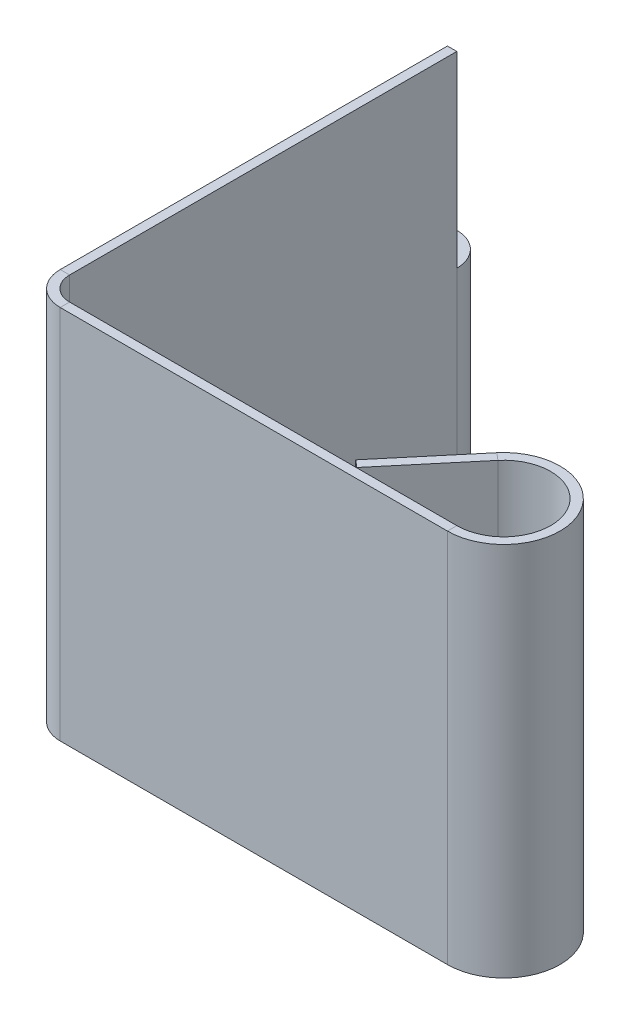
ISO-10303-21;
HEADER;
FILE_DESCRIPTION(('STEP AP214'),'2;1');
FILE_NAME('part.step','',(''),(''),'','','');
FILE_SCHEMA(('AUTOMOTIVE_DESIGN { 1 0 10303 214 1 1 1 1 }'));
ENDSEC;
DATA;
#1=APPLICATION_CONTEXT('core data for automotive mechanical design processes');
#2=APPLICATION_PROTOCOL_DEFINITION('international standard','automotive_design',2000,#1);
#3=PRODUCT_CONTEXT('',#1,'mechanical');
#4=PRODUCT('Part','Part','',(#3));
#5=PRODUCT_RELATED_PRODUCT_CATEGORY('part','',(#4));
#6=PRODUCT_DEFINITION_FORMATION('','',#4);
#7=PRODUCT_DEFINITION_CONTEXT('part definition',#1,'design');
#8=PRODUCT_DEFINITION('design','',#6,#7);
#9=PRODUCT_DEFINITION_SHAPE('','',#8);
#10=(LENGTH_UNIT() NAMED_UNIT(*) SI_UNIT(.MILLI.,.METRE.));
#11=(NAMED_UNIT(*) PLANE_ANGLE_UNIT() SI_UNIT($,.RADIAN.));
#12=(NAMED_UNIT(*) SI_UNIT($,.STERADIAN.) SOLID_ANGLE_UNIT());
#13=UNCERTAINTY_MEASURE_WITH_UNIT(LENGTH_MEASURE(1.E-05),#10,'distance_accuracy_value','');
#14=(GEOMETRIC_REPRESENTATION_CONTEXT(3) GLOBAL_UNCERTAINTY_ASSIGNED_CONTEXT((#13)) GLOBAL_UNIT_ASSIGNED_CONTEXT((#10,
#11,#12)) REPRESENTATION_CONTEXT('',''));
#15=CARTESIAN_POINT('',(0.,0.,0.));
#16=DIRECTION('',(0.,0.,1.));
#17=DIRECTION('',(1.,0.,0.));
#18=AXIS2_PLACEMENT_3D('',#15,#16,#17);
#19=CARTESIAN_POINT('',(10.,160.,0.));
#20=DIRECTION('',(0.,1.,0.));
#21=DIRECTION('',(0.,0.,1.));
#22=AXIS2_PLACEMENT_3D('',#19,#20,#21);
#23=PLANE('',#22);
#24=DIRECTION('',(0.,0.,1.));
#25=VECTOR('',#24,1.);
#26=CARTESIAN_POINT('',(10.,160.,0.));
#27=LINE('',#26,#25);
#28=CARTESIAN_POINT('',(10.,160.,0.));
#29=VERTEX_POINT('',#28);
#30=CARTESIAN_POINT('',(10.,160.,4.));
#31=VERTEX_POINT('',#30);
#32=EDGE_CURVE('E71',#29,#31,#27,.T.);
#33=ORIENTED_EDGE('',*,*,#32,.F.);
#34=CARTESIAN_POINT('',(10.,160.,-10.));
#35=DIRECTION('',(0.,1.,0.));
#36=DIRECTION('',(0.,0.,1.));
#37=AXIS2_PLACEMENT_3D('',#34,#35,#36);
#38=CIRCLE('',#37,10.);
#39=CARTESIAN_POINT('',(0.,160.,-10.0000000000001));
#40=VERTEX_POINT('',#39);
#41=EDGE_CURVE('E292',#40,#29,#38,.T.);
#42=ORIENTED_EDGE('',*,*,#41,.F.);
#43=DIRECTION('',(1.,0.,0.));
#44=VECTOR('',#43,1.);
#45=CARTESIAN_POINT('',(-4.,160.,-10.0000000000001));
#46=LINE('',#45,#44);
#47=CARTESIAN_POINT('',(-4.,160.,-10.0000000000001));
#48=VERTEX_POINT('',#47);
#49=EDGE_CURVE('E352',#48,#40,#46,.T.);
#50=ORIENTED_EDGE('',*,*,#49,.F.);
#51=CARTESIAN_POINT('',(10.,160.,-10.));
#52=DIRECTION('',(0.,1.,0.));
#53=DIRECTION('',(1.,0.,0.));
#54=AXIS2_PLACEMENT_3D('',#51,#52,#53);
#55=CIRCLE('',#54,14.);
#56=EDGE_CURVE('E304',#48,#31,#55,.T.);
#57=ORIENTED_EDGE('',*,*,#56,.T.);
#58=EDGE_LOOP('',(#33,#42,#50,#57));
#59=FACE_BOUND('',#58,.T.);
#60=ADVANCED_FACE('F63',(#59),#23,.T.);
#61=CARTESIAN_POINT('',(-4.,160.,-10.0000000000001));
#62=DIRECTION('',(0.,1.,0.));
#63=DIRECTION('',(0.,0.,1.));
#64=AXIS2_PLACEMENT_3D('',#61,#62,#63);
#65=PLANE('',#64);
#66=DIRECTION('',(1.,0.,0.));
#67=VECTOR('',#66,1.);
#68=CARTESIAN_POINT('',(10.0000000000001,160.,0.));
#69=LINE('',#68,#67);
#70=CARTESIAN_POINT('',(175.,160.,0.));
#71=VERTEX_POINT('',#70);
#72=EDGE_CURVE('E289',#29,#71,#69,.T.);
#73=ORIENTED_EDGE('',*,*,#72,.F.);
#74=ORIENTED_EDGE('',*,*,#32,.T.);
#75=DIRECTION('',(1.,0.,0.));
#76=VECTOR('',#75,1.);
#77=CARTESIAN_POINT('',(10.0000000000001,160.,4.));
#78=LINE('',#77,#76);
#79=CARTESIAN_POINT('',(175.,160.,4.));
#80=VERTEX_POINT('',#79);
#81=EDGE_CURVE('E285',#31,#80,#78,.T.);
#82=ORIENTED_EDGE('',*,*,#81,.T.);
#83=DIRECTION('',(0.,0.,1.));
#84=VECTOR('',#83,1.);
#85=CARTESIAN_POINT('',(175.,160.,0.));
#86=LINE('',#85,#84);
#87=EDGE_CURVE('E218',#71,#80,#86,.T.);
#88=ORIENTED_EDGE('',*,*,#87,.F.);
#89=EDGE_LOOP('',(#73,#74,#82,#88));
#90=FACE_BOUND('',#89,.T.);
#91=ADVANCED_FACE('F355',(#90),#65,.T.);
#92=CARTESIAN_POINT('',(0.,0.,-10.0000000000001));
#93=DIRECTION('',(0.,-1.,0.));
#94=DIRECTION('',(0.,0.,-1.));
#95=AXIS2_PLACEMENT_3D('',#92,#93,#94);
#96=PLANE('',#95);
#97=DIRECTION('',(-1.,0.,0.));
#98=VECTOR('',#97,1.);
#99=CARTESIAN_POINT('',(0.,0.,-10.0000000000001));
#100=LINE('',#99,#98);
#101=CARTESIAN_POINT('',(0.,0.,-10.0000000000001));
#102=VERTEX_POINT('',#101);
#103=CARTESIAN_POINT('',(-4.,0.,-10.0000000000001));
#104=VERTEX_POINT('',#103);
#105=EDGE_CURVE('E350',#102,#104,#100,.T.);
#106=ORIENTED_EDGE('',*,*,#105,.F.);
#107=CARTESIAN_POINT('',(10.,0.,-10.));
#108=DIRECTION('',(0.,1.,0.));
#109=DIRECTION('',(0.,0.,1.));
#110=AXIS2_PLACEMENT_3D('',#107,#108,#109);
#111=CIRCLE('',#110,10.);
#112=CARTESIAN_POINT('',(10.,0.,0.));
#113=VERTEX_POINT('',#112);
#114=EDGE_CURVE('E315',#102,#113,#111,.T.);
#115=ORIENTED_EDGE('',*,*,#114,.T.);
#116=DIRECTION('',(0.,0.,-1.));
#117=VECTOR('',#116,1.);
#118=CARTESIAN_POINT('',(10.,0.,4.));
#119=LINE('',#118,#117);
#120=CARTESIAN_POINT('',(10.,0.,4.));
#121=VERTEX_POINT('',#120);
#122=EDGE_CURVE('E348',#121,#113,#119,.T.);
#123=ORIENTED_EDGE('',*,*,#122,.F.);
#124=CARTESIAN_POINT('',(10.,0.,-10.));
#125=DIRECTION('',(0.,1.,0.));
#126=DIRECTION('',(1.,0.,0.));
#127=AXIS2_PLACEMENT_3D('',#124,#125,#126);
#128=CIRCLE('',#127,14.);
#129=EDGE_CURVE('E287',#104,#121,#128,.T.);
#130=ORIENTED_EDGE('',*,*,#129,.F.);
#131=EDGE_LOOP('',(#106,#115,#123,#130));
#132=FACE_BOUND('',#131,.T.);
#133=ADVANCED_FACE('F405',(#132),#96,.T.);
#134=CARTESIAN_POINT('',(10.,0.,4.));
#135=DIRECTION('',(0.,-1.,0.));
#136=DIRECTION('',(0.,0.,-1.));
#137=AXIS2_PLACEMENT_3D('',#134,#135,#136);
#138=PLANE('',#137);
#139=DIRECTION('',(0.,0.,1.));
#140=VECTOR('',#139,1.);
#141=CARTESIAN_POINT('',(0.,0.,-175.));
#142=LINE('',#141,#140);
#143=CARTESIAN_POINT('',(0.,0.,-175.));
#144=VERTEX_POINT('',#143);
#145=EDGE_CURVE('E318',#144,#102,#142,.T.);
#146=ORIENTED_EDGE('',*,*,#145,.T.);
#147=ORIENTED_EDGE('',*,*,#105,.T.);
#148=DIRECTION('',(0.,0.,1.));
#149=VECTOR('',#148,1.);
#150=CARTESIAN_POINT('',(-4.,0.,-175.));
#151=LINE('',#150,#149);
#152=CARTESIAN_POINT('',(-4.,0.,-175.));
#153=VERTEX_POINT('',#152);
#154=EDGE_CURVE('E323',#153,#104,#151,.T.);
#155=ORIENTED_EDGE('',*,*,#154,.F.);
#156=DIRECTION('',(1.,0.,0.));
#157=VECTOR('',#156,1.);
#158=CARTESIAN_POINT('',(-4.,0.,-175.));
#159=LINE('',#158,#157);
#160=EDGE_CURVE('E321',#153,#144,#159,.T.);
#161=ORIENTED_EDGE('',*,*,#160,.T.);
#162=EDGE_LOOP('',(#146,#147,#155,#161));
#163=FACE_BOUND('',#162,.T.);
#164=ADVANCED_FACE('F407',(#163),#138,.T.);
#165=CARTESIAN_POINT('',(10.0000000000001,160.,4.));
#166=DIRECTION('',(0.,0.,-1.));
#167=DIRECTION('',(-1.,0.,0.));
#168=AXIS2_PLACEMENT_3D('',#165,#166,#167);
#169=PLANE('',#168);
#170=DIRECTION('',(1.,0.,0.));
#171=VECTOR('',#170,1.);
#172=CARTESIAN_POINT('',(10.0000000000001,0.,4.));
#173=LINE('',#172,#171);
#174=CARTESIAN_POINT('',(175.,0.,4.00000000000002));
#175=VERTEX_POINT('',#174);
#176=EDGE_CURVE('E276',#121,#175,#173,.T.);
#177=ORIENTED_EDGE('',*,*,#176,.T.);
#178=DIRECTION('',(0.,-1.,0.));
#179=VECTOR('',#178,1.);
#180=CARTESIAN_POINT('',(175.,160.,4.));
#181=LINE('',#180,#179);
#182=EDGE_CURVE('E346',#80,#175,#181,.T.);
#183=ORIENTED_EDGE('',*,*,#182,.F.);
#184=ORIENTED_EDGE('',*,*,#81,.F.);
#185=DIRECTION('',(0.,-1.,0.));
#186=VECTOR('',#185,1.);
#187=CARTESIAN_POINT('',(10.,160.,4.));
#188=LINE('',#187,#186);
#189=EDGE_CURVE('E307',#31,#121,#188,.T.);
#190=ORIENTED_EDGE('',*,*,#189,.T.);
#191=EDGE_LOOP('',(#177,#183,#184,#190));
#192=FACE_BOUND('',#191,.T.);
#193=ADVANCED_FACE('F368',(#192),#169,.F.);
#194=CARTESIAN_POINT('',(10.0000000000001,160.,0.));
#195=DIRECTION('',(0.,0.,-1.));
#196=DIRECTION('',(-1.,0.,0.));
#197=AXIS2_PLACEMENT_3D('',#194,#195,#196);
#198=PLANE('',#197);
#199=DIRECTION('',(1.,0.,0.));
#200=VECTOR('',#199,1.);
#201=CARTESIAN_POINT('',(10.0000000000001,0.,0.));
#202=LINE('',#201,#200);
#203=CARTESIAN_POINT('',(175.,0.,0.));
#204=VERTEX_POINT('',#203);
#205=EDGE_CURVE('E312',#113,#204,#202,.T.);
#206=ORIENTED_EDGE('',*,*,#205,.F.);
#207=DIRECTION('',(0.,-1.,0.));
#208=VECTOR('',#207,1.);
#209=CARTESIAN_POINT('',(10.,160.,0.));
#210=LINE('',#209,#208);
#211=EDGE_CURVE('E341',#29,#113,#210,.T.);
#212=ORIENTED_EDGE('',*,*,#211,.F.);
#213=ORIENTED_EDGE('',*,*,#72,.T.);
#214=DIRECTION('',(0.,-1.,0.));
#215=VECTOR('',#214,1.);
#216=CARTESIAN_POINT('',(175.,160.,0.));
#217=LINE('',#216,#215);
#218=EDGE_CURVE('E344',#71,#204,#217,.T.);
#219=ORIENTED_EDGE('',*,*,#218,.T.);
#220=EDGE_LOOP('',(#206,#212,#213,#219));
#221=FACE_BOUND('',#220,.T.);
#222=ADVANCED_FACE('F385',(#221),#198,.T.);
#223=CARTESIAN_POINT('',(10.,160.,-10.));
#224=DIRECTION('',(0.,-1.,0.));
#225=DIRECTION('',(0.,0.,-1.));
#226=AXIS2_PLACEMENT_3D('',#223,#224,#225);
#227=CYLINDRICAL_SURFACE('',#226,10.);
#228=ORIENTED_EDGE('',*,*,#114,.F.);
#229=DIRECTION('',(0.,-1.,0.));
#230=VECTOR('',#229,1.);
#231=CARTESIAN_POINT('',(0.,160.,-10.0000000000001));
#232=LINE('',#231,#230);
#233=EDGE_CURVE('E338',#40,#102,#232,.T.);
#234=ORIENTED_EDGE('',*,*,#233,.F.);
#235=ORIENTED_EDGE('',*,*,#41,.T.);
#236=ORIENTED_EDGE('',*,*,#211,.T.);
#237=EDGE_LOOP('',(#228,#234,#235,#236));
#238=FACE_BOUND('',#237,.T.);
#239=ADVANCED_FACE('F391',(#238),#227,.F.);
#240=CARTESIAN_POINT('',(0.,160.,-175.));
#241=DIRECTION('',(1.,0.,0.));
#242=DIRECTION('',(0.,0.,-1.));
#243=AXIS2_PLACEMENT_3D('',#240,#241,#242);
#244=PLANE('',#243);
#245=ORIENTED_EDGE('',*,*,#145,.F.);
#246=DIRECTION('',(0.,-1.,0.));
#247=VECTOR('',#246,1.);
#248=CARTESIAN_POINT('',(0.,160.,-175.));
#249=LINE('',#248,#247);
#250=CARTESIAN_POINT('',(0.,80.,-175.));
#251=VERTEX_POINT('',#250);
#252=EDGE_CURVE('E78',#251,#144,#249,.T.);
#253=ORIENTED_EDGE('',*,*,#252,.F.);
#254=CARTESIAN_POINT('',(0.,160.,-175.));
#255=VERTEX_POINT('',#254);
#256=EDGE_CURVE('E336',#255,#251,#249,.T.);
#257=ORIENTED_EDGE('',*,*,#256,.F.);
#258=DIRECTION('',(0.,0.,1.));
#259=VECTOR('',#258,1.);
#260=CARTESIAN_POINT('',(0.,160.,-175.));
#261=LINE('',#260,#259);
#262=EDGE_CURVE('E295',#255,#40,#261,.T.);
#263=ORIENTED_EDGE('',*,*,#262,.T.);
#264=ORIENTED_EDGE('',*,*,#233,.T.);
#265=EDGE_LOOP('',(#245,#253,#257,#263,#264));
#266=FACE_BOUND('',#265,.T.);
#267=ADVANCED_FACE('F394',(#266),#244,.T.);
#268=CARTESIAN_POINT('',(-4.,160.,-175.));
#269=DIRECTION('',(0.,0.,-1.));
#270=DIRECTION('',(-1.,0.,0.));
#271=AXIS2_PLACEMENT_3D('',#268,#269,#270);
#272=PLANE('',#271);
#273=DIRECTION('',(1.,0.,0.));
#274=VECTOR('',#273,1.);
#275=CARTESIAN_POINT('',(-4.,80.,-175.));
#276=LINE('',#275,#274);
#277=CARTESIAN_POINT('',(-4.,80.,-175.));
#278=VERTEX_POINT('',#277);
#279=EDGE_CURVE('E13',#278,#251,#276,.T.);
#280=ORIENTED_EDGE('',*,*,#279,.F.);
#281=DIRECTION('',(0.,-1.,0.));
#282=VECTOR('',#281,1.);
#283=CARTESIAN_POINT('',(-4.,160.,-175.));
#284=LINE('',#283,#282);
#285=CARTESIAN_POINT('',(-4.,160.,-175.));
#286=VERTEX_POINT('',#285);
#287=EDGE_CURVE('E334',#286,#278,#284,.T.);
#288=ORIENTED_EDGE('',*,*,#287,.F.);
#289=DIRECTION('',(1.,0.,0.));
#290=VECTOR('',#289,1.);
#291=CARTESIAN_POINT('',(-4.,160.,-175.));
#292=LINE('',#291,#290);
#293=EDGE_CURVE('E298',#286,#255,#292,.T.);
#294=ORIENTED_EDGE('',*,*,#293,.T.);
#295=ORIENTED_EDGE('',*,*,#256,.T.);
#296=EDGE_LOOP('',(#280,#288,#294,#295));
#297=FACE_BOUND('',#296,.T.);
#298=ADVANCED_FACE('F398',(#297),#272,.T.);
#299=CARTESIAN_POINT('',(-4.,160.,-175.));
#300=DIRECTION('',(1.,0.,0.));
#301=DIRECTION('',(0.,0.,-1.));
#302=AXIS2_PLACEMENT_3D('',#299,#300,#301);
#303=PLANE('',#302);
#304=ORIENTED_EDGE('',*,*,#154,.T.);
#305=DIRECTION('',(0.,-1.,0.));
#306=VECTOR('',#305,1.);
#307=CARTESIAN_POINT('',(-4.,160.,-10.0000000000001));
#308=LINE('',#307,#306);
#309=EDGE_CURVE('E330',#48,#104,#308,.T.);
#310=ORIENTED_EDGE('',*,*,#309,.F.);
#311=DIRECTION('',(0.,0.,1.));
#312=VECTOR('',#311,1.);
#313=CARTESIAN_POINT('',(-4.,160.,-175.));
#314=LINE('',#313,#312);
#315=EDGE_CURVE('E301',#286,#48,#314,.T.);
#316=ORIENTED_EDGE('',*,*,#315,.F.);
#317=ORIENTED_EDGE('',*,*,#287,.T.);
#318=EDGE_CURVE('E333',#278,#153,#284,.T.);
#319=ORIENTED_EDGE('',*,*,#318,.T.);
#320=EDGE_LOOP('',(#304,#310,#316,#317,#319));
#321=FACE_BOUND('',#320,.T.);
#322=ADVANCED_FACE('F403',(#321),#303,.F.);
#323=CARTESIAN_POINT('',(10.,160.,-10.));
#324=DIRECTION('',(0.,-1.,0.));
#325=DIRECTION('',(0.,0.,-1.));
#326=AXIS2_PLACEMENT_3D('',#323,#324,#325);
#327=CYLINDRICAL_SURFACE('',#326,14.);
#328=ORIENTED_EDGE('',*,*,#129,.T.);
#329=ORIENTED_EDGE('',*,*,#189,.F.);
#330=ORIENTED_EDGE('',*,*,#56,.F.);
#331=ORIENTED_EDGE('',*,*,#309,.T.);
#332=EDGE_LOOP('',(#328,#329,#330,#331));
#333=FACE_BOUND('',#332,.T.);
#334=ADVANCED_FACE('F364',(#333),#327,.T.);
#335=CARTESIAN_POINT('',(10.,160.,-10.));
#336=DIRECTION('',(0.,1.,0.));
#337=DIRECTION('',(1.,0.,0.));
#338=AXIS2_PLACEMENT_3D('',#335,#336,#337);
#339=PLANE('',#338);
#340=ORIENTED_EDGE('',*,*,#315,.T.);
#341=ORIENTED_EDGE('',*,*,#49,.T.);
#342=ORIENTED_EDGE('',*,*,#262,.F.);
#343=ORIENTED_EDGE('',*,*,#293,.F.);
#344=EDGE_LOOP('',(#340,#341,#342,#343));
#345=FACE_BOUND('',#344,.T.);
#346=ADVANCED_FACE('F397',(#345),#339,.T.);
#347=CARTESIAN_POINT('',(10.,0.,-10.));
#348=DIRECTION('',(0.,1.,0.));
#349=DIRECTION('',(1.,0.,0.));
#350=AXIS2_PLACEMENT_3D('',#347,#348,#349);
#351=PLANE('',#350);
#352=ORIENTED_EDGE('',*,*,#176,.F.);
#353=ORIENTED_EDGE('',*,*,#122,.T.);
#354=ORIENTED_EDGE('',*,*,#205,.T.);
#355=DIRECTION('',(0.,0.,1.));
#356=VECTOR('',#355,1.);
#357=CARTESIAN_POINT('',(175.,0.,0.));
#358=LINE('',#357,#356);
#359=EDGE_CURVE('E310',#204,#175,#358,.T.);
#360=ORIENTED_EDGE('',*,*,#359,.T.);
#361=EDGE_LOOP('',(#352,#353,#354,#360));
#362=FACE_BOUND('',#361,.T.);
#363=ADVANCED_FACE('F387',(#362),#351,.F.);
#364=CARTESIAN_POINT('',(-14.,80.,-175.));
#365=DIRECTION('',(0.,1.,0.));
#366=DIRECTION('',(0.,0.,1.));
#367=AXIS2_PLACEMENT_3D('',#364,#365,#366);
#368=PLANE('',#367);
#369=DIRECTION('',(0.,0.,1.));
#370=VECTOR('',#369,1.);
#371=CARTESIAN_POINT('',(-14.,80.,-189.));
#372=LINE('',#371,#370);
#373=CARTESIAN_POINT('',(-13.9999999999999,80.,-185.));
#374=VERTEX_POINT('',#373);
#375=CARTESIAN_POINT('',(-13.9999999999999,80.,-189.));
#376=VERTEX_POINT('',#375);
#377=EDGE_CURVE('E203',#374,#376,#372,.F.);
#378=ORIENTED_EDGE('',*,*,#377,.F.);
#379=CARTESIAN_POINT('',(-14.,80.,-175.));
#380=DIRECTION('',(0.,-1.,0.));
#381=DIRECTION('',(0.,0.,-1.));
#382=AXIS2_PLACEMENT_3D('',#379,#380,#381);
#383=CIRCLE('',#382,9.99999999999998);
#384=EDGE_CURVE('E280',#278,#374,#383,.F.);
#385=ORIENTED_EDGE('',*,*,#384,.F.);
#386=ORIENTED_EDGE('',*,*,#279,.T.);
#387=CARTESIAN_POINT('',(-14.,80.,-175.));
#388=DIRECTION('',(0.,-1.,0.));
#389=DIRECTION('',(0.,0.,-1.));
#390=AXIS2_PLACEMENT_3D('',#387,#388,#389);
#391=CIRCLE('',#390,14.);
#392=EDGE_CURVE('E273',#251,#376,#391,.F.);
#393=ORIENTED_EDGE('',*,*,#392,.T.);
#394=EDGE_LOOP('',(#378,#385,#386,#393));
#395=FACE_BOUND('',#394,.T.);
#396=ADVANCED_FACE('F435',(#395),#368,.T.);
#397=CARTESIAN_POINT('',(-14.,0.,-175.));
#398=DIRECTION('',(0.,1.,0.));
#399=DIRECTION('',(0.,0.,1.));
#400=AXIS2_PLACEMENT_3D('',#397,#398,#399);
#401=PLANE('',#400);
#402=CARTESIAN_POINT('',(-14.,0.,-175.));
#403=DIRECTION('',(0.,-1.,0.));
#404=DIRECTION('',(0.,0.,-1.));
#405=AXIS2_PLACEMENT_3D('',#402,#403,#404);
#406=CIRCLE('',#405,9.99999999999998);
#407=CARTESIAN_POINT('',(-13.9999999999999,0.,-185.));
#408=VERTEX_POINT('',#407);
#409=EDGE_CURVE('E246',#408,#153,#406,.T.);
#410=ORIENTED_EDGE('',*,*,#409,.F.);
#411=DIRECTION('',(0.,0.,1.));
#412=VECTOR('',#411,1.);
#413=CARTESIAN_POINT('',(-14.,0.,-185.));
#414=LINE('',#413,#412);
#415=CARTESIAN_POINT('',(-14.,0.,-189.));
#416=VERTEX_POINT('',#415);
#417=EDGE_CURVE('E266',#408,#416,#414,.F.);
#418=ORIENTED_EDGE('',*,*,#417,.T.);
#419=CARTESIAN_POINT('',(-14.,0.,-175.));
#420=DIRECTION('',(0.,-1.,0.));
#421=DIRECTION('',(0.,0.,-1.));
#422=AXIS2_PLACEMENT_3D('',#419,#420,#421);
#423=CIRCLE('',#422,14.);
#424=EDGE_CURVE('E277',#416,#144,#423,.T.);
#425=ORIENTED_EDGE('',*,*,#424,.T.);
#426=ORIENTED_EDGE('',*,*,#160,.F.);
#427=EDGE_LOOP('',(#410,#418,#425,#426));
#428=FACE_BOUND('',#427,.T.);
#429=ADVANCED_FACE('F414',(#428),#401,.F.);
#430=CARTESIAN_POINT('',(-14.,0.,-175.));
#431=DIRECTION('',(0.,-1.,0.));
#432=DIRECTION('',(0.,0.,-1.));
#433=AXIS2_PLACEMENT_3D('',#430,#431,#432);
#434=CYLINDRICAL_SURFACE('',#433,14.);
#435=ORIENTED_EDGE('',*,*,#252,.T.);
#436=ORIENTED_EDGE('',*,*,#424,.F.);
#437=DIRECTION('',(0.,-1.,0.));
#438=VECTOR('',#437,1.);
#439=CARTESIAN_POINT('',(-14.,80.,-189.));
#440=LINE('',#439,#438);
#441=EDGE_CURVE('E264',#416,#376,#440,.F.);
#442=ORIENTED_EDGE('',*,*,#441,.T.);
#443=ORIENTED_EDGE('',*,*,#392,.F.);
#444=EDGE_LOOP('',(#435,#436,#442,#443));
#445=FACE_BOUND('',#444,.T.);
#446=ADVANCED_FACE('F411',(#445),#434,.T.);
#447=CARTESIAN_POINT('',(-14.,0.,-175.));
#448=DIRECTION('',(0.,-1.,0.));
#449=DIRECTION('',(0.,0.,-1.));
#450=AXIS2_PLACEMENT_3D('',#447,#448,#449);
#451=CYLINDRICAL_SURFACE('',#450,9.99999999999998);
#452=ORIENTED_EDGE('',*,*,#318,.F.);
#453=ORIENTED_EDGE('',*,*,#384,.T.);
#454=DIRECTION('',(0.,-1.,0.));
#455=VECTOR('',#454,1.);
#456=CARTESIAN_POINT('',(-14.,80.,-185.));
#457=LINE('',#456,#455);
#458=EDGE_CURVE('E269',#374,#408,#457,.T.);
#459=ORIENTED_EDGE('',*,*,#458,.T.);
#460=ORIENTED_EDGE('',*,*,#409,.T.);
#461=EDGE_LOOP('',(#452,#453,#459,#460));
#462=FACE_BOUND('',#461,.T.);
#463=ADVANCED_FACE('F438',(#462),#451,.F.);
#464=CARTESIAN_POINT('',(-3.99999999999999,80.,-189.));
#465=DIRECTION('',(0.,-1.,0.));
#466=DIRECTION('',(0.,0.,-1.));
#467=AXIS2_PLACEMENT_3D('',#464,#465,#466);
#468=PLANE('',#467);
#469=ORIENTED_EDGE('',*,*,#377,.T.);
#470=DIRECTION('',(1.,0.,0.));
#471=VECTOR('',#470,1.);
#472=CARTESIAN_POINT('',(6.47491917722304E-13,80.,-189.));
#473=LINE('',#472,#471);
#474=CARTESIAN_POINT('',(-50.,80.,-189.));
#475=VERTEX_POINT('',#474);
#476=EDGE_CURVE('E254',#475,#376,#473,.T.);
#477=ORIENTED_EDGE('',*,*,#476,.F.);
#478=DIRECTION('',(0.,0.,1.));
#479=VECTOR('',#478,1.);
#480=CARTESIAN_POINT('',(-50.,80.,-189.));
#481=LINE('',#480,#479);
#482=CARTESIAN_POINT('',(-50.,80.,-185.));
#483=VERTEX_POINT('',#482);
#484=EDGE_CURVE('E247',#475,#483,#481,.T.);
#485=ORIENTED_EDGE('',*,*,#484,.T.);
#486=DIRECTION('',(-1.,0.,0.));
#487=VECTOR('',#486,1.);
#488=CARTESIAN_POINT('',(-4.,80.,-185.));
#489=LINE('',#488,#487);
#490=EDGE_CURVE('E261',#483,#374,#489,.F.);
#491=ORIENTED_EDGE('',*,*,#490,.T.);
#492=EDGE_LOOP('',(#469,#477,#485,#491));
#493=FACE_BOUND('',#492,.T.);
#494=ADVANCED_FACE('F432',(#493),#468,.F.);
#495=CARTESIAN_POINT('',(-50.,0.,-189.));
#496=DIRECTION('',(0.,1.,0.));
#497=DIRECTION('',(0.,0.,1.));
#498=AXIS2_PLACEMENT_3D('',#495,#496,#497);
#499=PLANE('',#498);
#500=ORIENTED_EDGE('',*,*,#417,.F.);
#501=DIRECTION('',(1.,0.,0.));
#502=VECTOR('',#501,1.);
#503=CARTESIAN_POINT('',(-50.,0.,-185.));
#504=LINE('',#503,#502);
#505=CARTESIAN_POINT('',(-50.,0.,-185.));
#506=VERTEX_POINT('',#505);
#507=EDGE_CURVE('E259',#408,#506,#504,.F.);
#508=ORIENTED_EDGE('',*,*,#507,.T.);
#509=DIRECTION('',(0.,0.,1.));
#510=VECTOR('',#509,1.);
#511=CARTESIAN_POINT('',(-50.,0.,-189.));
#512=LINE('',#511,#510);
#513=CARTESIAN_POINT('',(-50.,0.,-189.));
#514=VERTEX_POINT('',#513);
#515=EDGE_CURVE('E243',#514,#506,#512,.T.);
#516=ORIENTED_EDGE('',*,*,#515,.F.);
#517=DIRECTION('',(-1.,0.,0.));
#518=VECTOR('',#517,1.);
#519=CARTESIAN_POINT('',(6.47491917722304E-13,0.,-189.));
#520=LINE('',#519,#518);
#521=EDGE_CURVE('E252',#416,#514,#520,.T.);
#522=ORIENTED_EDGE('',*,*,#521,.F.);
#523=EDGE_LOOP('',(#500,#508,#516,#522));
#524=FACE_BOUND('',#523,.T.);
#525=ADVANCED_FACE('F424',(#524),#499,.F.);
#526=CARTESIAN_POINT('',(6.47491917722304E-13,0.,-189.));
#527=DIRECTION('',(0.,0.,1.));
#528=DIRECTION('',(1.,0.,0.));
#529=AXIS2_PLACEMENT_3D('',#526,#527,#528);
#530=PLANE('',#529);
#531=ORIENTED_EDGE('',*,*,#441,.F.);
#532=ORIENTED_EDGE('',*,*,#521,.T.);
#533=DIRECTION('',(0.,1.,0.));
#534=VECTOR('',#533,1.);
#535=CARTESIAN_POINT('',(-50.,0.,-189.));
#536=LINE('',#535,#534);
#537=EDGE_CURVE('E250',#514,#475,#536,.T.);
#538=ORIENTED_EDGE('',*,*,#537,.T.);
#539=ORIENTED_EDGE('',*,*,#476,.T.);
#540=EDGE_LOOP('',(#531,#532,#538,#539));
#541=FACE_BOUND('',#540,.T.);
#542=ADVANCED_FACE('F421',(#541),#530,.F.);
#543=CARTESIAN_POINT('',(6.33533189556568E-13,0.,-185.));
#544=DIRECTION('',(0.,0.,1.));
#545=DIRECTION('',(1.,0.,0.));
#546=AXIS2_PLACEMENT_3D('',#543,#544,#545);
#547=PLANE('',#546);
#548=ORIENTED_EDGE('',*,*,#507,.F.);
#549=ORIENTED_EDGE('',*,*,#458,.F.);
#550=ORIENTED_EDGE('',*,*,#490,.F.);
#551=DIRECTION('',(0.,-1.,0.));
#552=VECTOR('',#551,1.);
#553=CARTESIAN_POINT('',(-50.,80.,-185.));
#554=LINE('',#553,#552);
#555=EDGE_CURVE('E257',#506,#483,#554,.F.);
#556=ORIENTED_EDGE('',*,*,#555,.F.);
#557=EDGE_LOOP('',(#548,#549,#550,#556));
#558=FACE_BOUND('',#557,.T.);
#559=ADVANCED_FACE('F440',(#558),#547,.T.);
#560=CARTESIAN_POINT('',(-50.,80.,-189.));
#561=DIRECTION('',(1.,0.,0.));
#562=DIRECTION('',(0.,0.,-1.));
#563=AXIS2_PLACEMENT_3D('',#560,#561,#562);
#564=PLANE('',#563);
#565=ORIENTED_EDGE('',*,*,#555,.T.);
#566=ORIENTED_EDGE('',*,*,#484,.F.);
#567=ORIENTED_EDGE('',*,*,#537,.F.);
#568=ORIENTED_EDGE('',*,*,#515,.T.);
#569=EDGE_LOOP('',(#565,#566,#567,#568));
#570=FACE_BOUND('',#569,.T.);
#571=ADVANCED_FACE('F429',(#570),#564,.F.);
#572=CARTESIAN_POINT('',(142.894587352207,0.,-19.0756309799231));
#573=DIRECTION('',(0.,1.,0.));
#574=DIRECTION('',(0.642787609686532,0.,-0.766044443118984));
#575=AXIS2_PLACEMENT_3D('',#572,#573,#574);
#576=PLANE('',#575);
#577=DIRECTION('',(-0.766044443118984,0.,-0.642787609686532));
#578=VECTOR('',#577,1.);
#579=CARTESIAN_POINT('',(156.614933365144,0.,-35.4269026324768));
#580=LINE('',#579,#578);
#581=CARTESIAN_POINT('',(159.67911113762,0.,-32.8557521937307));
#582=VERTEX_POINT('',#581);
#583=CARTESIAN_POINT('',(156.614933365144,0.,-35.4269026324768));
#584=VERTEX_POINT('',#583);
#585=EDGE_CURVE('E204',#582,#584,#580,.T.);
#586=ORIENTED_EDGE('',*,*,#585,.F.);
#587=DIRECTION('',(-0.642787609686532,0.,0.766044443118984));
#588=VECTOR('',#587,1.);
#589=CARTESIAN_POINT('',(145.958765124683,0.,-16.5044805411769));
#590=LINE('',#589,#588);
#591=CARTESIAN_POINT('',(132.238419111746,0.,-0.153208888623198));
#592=VERTEX_POINT('',#591);
#593=EDGE_CURVE('E234',#592,#582,#590,.F.);
#594=ORIENTED_EDGE('',*,*,#593,.F.);
#595=DIRECTION('',(-0.766044443118984,0.,-0.642787609686532));
#596=VECTOR('',#595,1.);
#597=CARTESIAN_POINT('',(129.17424133927,0.,-2.72435932736933));
#598=LINE('',#597,#596);
#599=CARTESIAN_POINT('',(129.17424133927,0.,-2.72435932736933));
#600=VERTEX_POINT('',#599);
#601=EDGE_CURVE('E238',#592,#600,#598,.T.);
#602=ORIENTED_EDGE('',*,*,#601,.T.);
#603=DIRECTION('',(0.642787609686532,0.,-0.766044443118984));
#604=VECTOR('',#603,1.);
#605=CARTESIAN_POINT('',(142.894587352207,0.,-19.0756309799231));
#606=LINE('',#605,#604);
#607=EDGE_CURVE('E214',#600,#584,#606,.T.);
#608=ORIENTED_EDGE('',*,*,#607,.T.);
#609=EDGE_LOOP('',(#586,#594,#602,#608));
#610=FACE_BOUND('',#609,.T.);
#611=ADVANCED_FACE('F375',(#610),#576,.F.);
#612=CARTESIAN_POINT('',(129.17424133927,80.,-2.72435932736933));
#613=DIRECTION('',(0.642787609686532,0.,-0.766044443118984));
#614=DIRECTION('',(0.,-1.,0.));
#615=AXIS2_PLACEMENT_3D('',#612,#613,#614);
#616=PLANE('',#615);
#617=ORIENTED_EDGE('',*,*,#601,.F.);
#618=DIRECTION('',(0.,1.,0.));
#619=VECTOR('',#618,1.);
#620=CARTESIAN_POINT('',(132.238419111746,80.,-0.153208888623198));
#621=LINE('',#620,#619);
#622=CARTESIAN_POINT('',(132.238419111746,160.,-0.153208888623198));
#623=VERTEX_POINT('',#622);
#624=EDGE_CURVE('E191',#623,#592,#621,.F.);
#625=ORIENTED_EDGE('',*,*,#624,.F.);
#626=DIRECTION('',(-0.766044443118984,0.,-0.642787609686532));
#627=VECTOR('',#626,1.);
#628=CARTESIAN_POINT('',(129.17424133927,160.,-2.72435932736933));
#629=LINE('',#628,#627);
#630=CARTESIAN_POINT('',(129.17424133927,160.,-2.72435932736933));
#631=VERTEX_POINT('',#630);
#632=EDGE_CURVE('E230',#623,#631,#629,.T.);
#633=ORIENTED_EDGE('',*,*,#632,.T.);
#634=DIRECTION('',(0.,-1.,0.));
#635=VECTOR('',#634,1.);
#636=CARTESIAN_POINT('',(129.17424133927,80.,-2.72435932736933));
#637=LINE('',#636,#635);
#638=EDGE_CURVE('E189',#631,#600,#637,.T.);
#639=ORIENTED_EDGE('',*,*,#638,.T.);
#640=EDGE_LOOP('',(#617,#625,#633,#639));
#641=FACE_BOUND('',#640,.T.);
#642=ADVANCED_FACE('F551',(#641),#616,.F.);
#643=CARTESIAN_POINT('',(142.894587352207,160.,-19.0756309799231));
#644=DIRECTION('',(0.,-1.,0.));
#645=DIRECTION('',(-0.642787609686532,0.,0.766044443118984));
#646=AXIS2_PLACEMENT_3D('',#643,#644,#645);
#647=PLANE('',#646);
#648=DIRECTION('',(-0.642787609686532,0.,0.766044443118984));
#649=VECTOR('',#648,1.);
#650=CARTESIAN_POINT('',(145.958765124683,160.,-16.5044805411769));
#651=LINE('',#650,#649);
#652=CARTESIAN_POINT('',(159.67911113762,160.,-32.8557521937307));
#653=VERTEX_POINT('',#652);
#654=EDGE_CURVE('E198',#653,#623,#651,.T.);
#655=ORIENTED_EDGE('',*,*,#654,.F.);
#656=DIRECTION('',(-0.766044443118984,0.,-0.642787609686532));
#657=VECTOR('',#656,1.);
#658=CARTESIAN_POINT('',(156.614933365144,160.,-35.4269026324768));
#659=LINE('',#658,#657);
#660=CARTESIAN_POINT('',(156.614933365144,160.,-35.4269026324768));
#661=VERTEX_POINT('',#660);
#662=EDGE_CURVE('E195',#653,#661,#659,.T.);
#663=ORIENTED_EDGE('',*,*,#662,.T.);
#664=DIRECTION('',(-0.642787609686532,0.,0.766044443118984));
#665=VECTOR('',#664,1.);
#666=CARTESIAN_POINT('',(142.894587352207,160.,-19.0756309799231));
#667=LINE('',#666,#665);
#668=EDGE_CURVE('E181',#661,#631,#667,.T.);
#669=ORIENTED_EDGE('',*,*,#668,.T.);
#670=ORIENTED_EDGE('',*,*,#632,.F.);
#671=EDGE_LOOP('',(#655,#663,#669,#670));
#672=FACE_BOUND('',#671,.T.);
#673=ADVANCED_FACE('F196',(#672),#647,.F.);
#674=CARTESIAN_POINT('',(142.894587352207,80.,-19.0756309799231));
#675=DIRECTION('',(-0.766044443118984,0.,-0.642787609686532));
#676=DIRECTION('',(-0.642787609686532,0.,0.766044443118984));
#677=AXIS2_PLACEMENT_3D('',#674,#675,#676);
#678=PLANE('',#677);
#679=ORIENTED_EDGE('',*,*,#638,.F.);
#680=ORIENTED_EDGE('',*,*,#668,.F.);
#681=DIRECTION('',(0.,1.,0.));
#682=VECTOR('',#681,1.);
#683=CARTESIAN_POINT('',(156.614933365144,80.,-35.4269026324768));
#684=LINE('',#683,#682);
#685=EDGE_CURVE('E186',#584,#661,#684,.T.);
#686=ORIENTED_EDGE('',*,*,#685,.F.);
#687=ORIENTED_EDGE('',*,*,#607,.F.);
#688=EDGE_LOOP('',(#679,#680,#686,#687));
#689=FACE_BOUND('',#688,.T.);
#690=ADVANCED_FACE('F183',(#689),#678,.T.);
#691=CARTESIAN_POINT('',(145.958765124683,80.,-16.5044805411769));
#692=DIRECTION('',(-0.766044443118984,0.,-0.642787609686532));
#693=DIRECTION('',(-0.642787609686532,0.,0.766044443118984));
#694=AXIS2_PLACEMENT_3D('',#691,#692,#693);
#695=PLANE('',#694);
#696=ORIENTED_EDGE('',*,*,#624,.T.);
#697=ORIENTED_EDGE('',*,*,#593,.T.);
#698=DIRECTION('',(0.,1.,0.));
#699=VECTOR('',#698,1.);
#700=CARTESIAN_POINT('',(159.67911113762,80.,-32.8557521937307));
#701=LINE('',#700,#699);
#702=EDGE_CURVE('E220',#582,#653,#701,.T.);
#703=ORIENTED_EDGE('',*,*,#702,.T.);
#704=ORIENTED_EDGE('',*,*,#654,.T.);
#705=EDGE_LOOP('',(#696,#697,#703,#704));
#706=FACE_BOUND('',#705,.T.);
#707=ADVANCED_FACE('F378',(#706),#695,.F.);
#708=CARTESIAN_POINT('',(175.,160.,-20.));
#709=DIRECTION('',(0.,1.,0.));
#710=DIRECTION('',(0.,0.,1.));
#711=AXIS2_PLACEMENT_3D('',#708,#709,#710);
#712=PLANE('',#711);
#713=ORIENTED_EDGE('',*,*,#662,.F.);
#714=CARTESIAN_POINT('',(175.,160.,-20.));
#715=DIRECTION('',(0.,-1.,0.));
#716=DIRECTION('',(0.,0.,-1.));
#717=AXIS2_PLACEMENT_3D('',#714,#715,#716);
#718=CIRCLE('',#717,20.);
#719=EDGE_CURVE('E222',#71,#653,#718,.F.);
#720=ORIENTED_EDGE('',*,*,#719,.F.);
#721=ORIENTED_EDGE('',*,*,#87,.T.);
#722=CARTESIAN_POINT('',(175.,160.,-20.));
#723=DIRECTION('',(0.,-1.,0.));
#724=DIRECTION('',(0.,0.,-1.));
#725=AXIS2_PLACEMENT_3D('',#722,#723,#724);
#726=CIRCLE('',#725,24.);
#727=EDGE_CURVE('E211',#80,#661,#726,.F.);
#728=ORIENTED_EDGE('',*,*,#727,.T.);
#729=EDGE_LOOP('',(#713,#720,#721,#728));
#730=FACE_BOUND('',#729,.T.);
#731=ADVANCED_FACE('F217',(#730),#712,.T.);
#732=CARTESIAN_POINT('',(175.,0.,-20.));
#733=DIRECTION('',(0.,1.,0.));
#734=DIRECTION('',(0.,0.,1.));
#735=AXIS2_PLACEMENT_3D('',#732,#733,#734);
#736=PLANE('',#735);
#737=CARTESIAN_POINT('',(175.,0.,-20.));
#738=DIRECTION('',(0.,-1.,0.));
#739=DIRECTION('',(0.,0.,-1.));
#740=AXIS2_PLACEMENT_3D('',#737,#738,#739);
#741=CIRCLE('',#740,20.);
#742=EDGE_CURVE('E226',#582,#204,#741,.T.);
#743=ORIENTED_EDGE('',*,*,#742,.F.);
#744=ORIENTED_EDGE('',*,*,#585,.T.);
#745=CARTESIAN_POINT('',(175.,0.,-20.));
#746=DIRECTION('',(0.,-1.,0.));
#747=DIRECTION('',(0.,0.,-1.));
#748=AXIS2_PLACEMENT_3D('',#745,#746,#747);
#749=CIRCLE('',#748,24.);
#750=EDGE_CURVE('E213',#584,#175,#749,.T.);
#751=ORIENTED_EDGE('',*,*,#750,.T.);
#752=ORIENTED_EDGE('',*,*,#359,.F.);
#753=EDGE_LOOP('',(#743,#744,#751,#752));
#754=FACE_BOUND('',#753,.T.);
#755=ADVANCED_FACE('F372',(#754),#736,.F.);
#756=CARTESIAN_POINT('',(175.,0.,-20.));
#757=DIRECTION('',(0.,-1.,0.));
#758=DIRECTION('',(-0.766044443118984,0.,-0.642787609686532));
#759=AXIS2_PLACEMENT_3D('',#756,#757,#758);
#760=CYLINDRICAL_SURFACE('',#759,24.);
#761=ORIENTED_EDGE('',*,*,#182,.T.);
#762=ORIENTED_EDGE('',*,*,#750,.F.);
#763=ORIENTED_EDGE('',*,*,#685,.T.);
#764=ORIENTED_EDGE('',*,*,#727,.F.);
#765=EDGE_LOOP('',(#761,#762,#763,#764));
#766=FACE_BOUND('',#765,.T.);
#767=ADVANCED_FACE('F210',(#766),#760,.T.);
#768=CARTESIAN_POINT('',(175.,0.,-20.));
#769=DIRECTION('',(0.,-1.,0.));
#770=DIRECTION('',(-0.766044443118984,0.,-0.642787609686532));
#771=AXIS2_PLACEMENT_3D('',#768,#769,#770);
#772=CYLINDRICAL_SURFACE('',#771,20.);
#773=ORIENTED_EDGE('',*,*,#218,.F.);
#774=ORIENTED_EDGE('',*,*,#719,.T.);
#775=ORIENTED_EDGE('',*,*,#702,.F.);
#776=ORIENTED_EDGE('',*,*,#742,.T.);
#777=EDGE_LOOP('',(#773,#774,#775,#776));
#778=FACE_BOUND('',#777,.T.);
#779=ADVANCED_FACE('F382',(#778),#772,.F.);
#780=CLOSED_SHELL('',(#60,#91,#133,#164,#193,#222,#239,#267,#298,#322,#334,#346,#363,#396,#429,
#446,#463,#494,#525,#542,#559,#571,#611,#642,#673,#690,#707,#731,#755,#767,#779));
#781=MANIFOLD_SOLID_BREP('B2',#780);
#782=ADVANCED_BREP_SHAPE_REPRESENTATION('',(#18,#781),#14);
#783=SHAPE_DEFINITION_REPRESENTATION(#9,#782);
ENDSEC;
END-ISO-10303-21;
